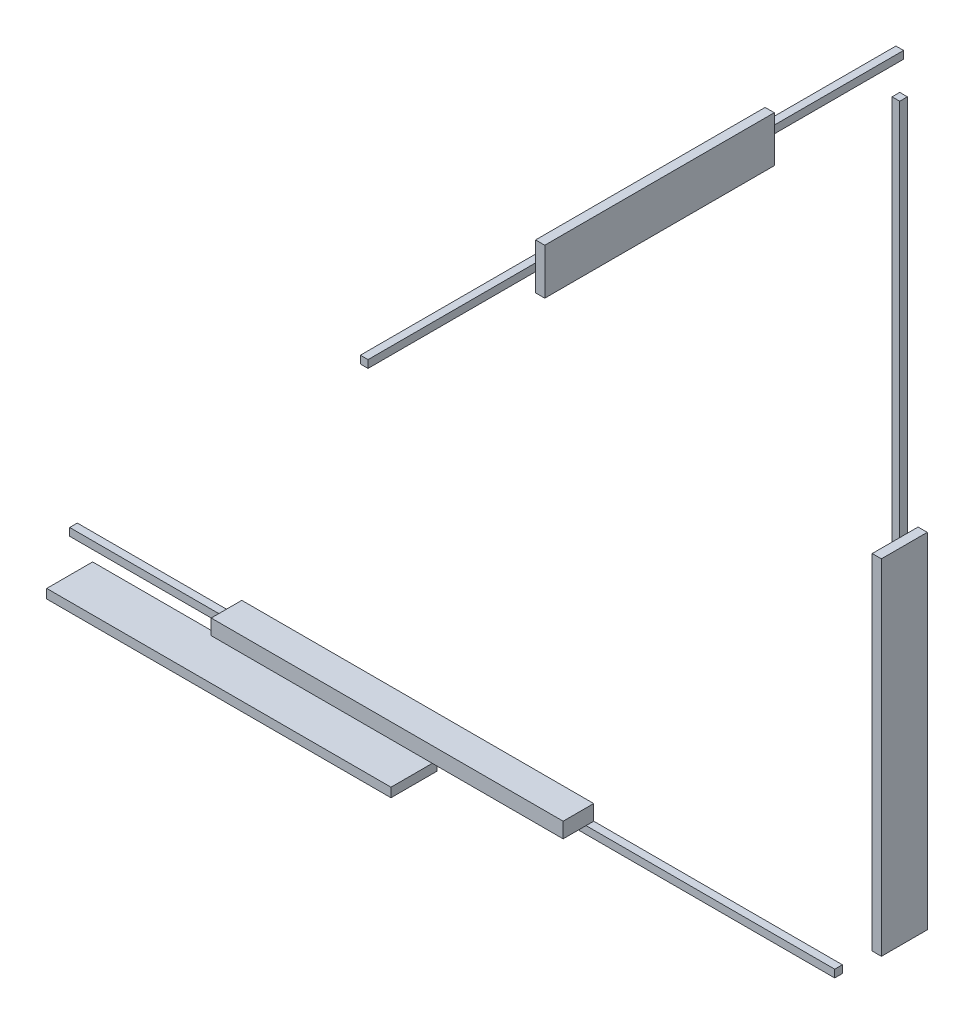
ISO-10303-21;
HEADER;
FILE_DESCRIPTION(('STEP AP214'),'2;1');
FILE_NAME('part.step','',(''),(''),'','','');
FILE_SCHEMA(('AUTOMOTIVE_DESIGN { 1 0 10303 214 1 1 1 1 }'));
ENDSEC;
DATA;
#1=APPLICATION_CONTEXT('core data for automotive mechanical design processes');
#2=APPLICATION_PROTOCOL_DEFINITION('international standard','automotive_design',2000,#1);
#3=PRODUCT_CONTEXT('',#1,'mechanical');
#4=PRODUCT('Part','Part','',(#3));
#5=PRODUCT_RELATED_PRODUCT_CATEGORY('part','',(#4));
#6=PRODUCT_DEFINITION_FORMATION('','',#4);
#7=PRODUCT_DEFINITION_CONTEXT('part definition',#1,'design');
#8=PRODUCT_DEFINITION('design','',#6,#7);
#9=PRODUCT_DEFINITION_SHAPE('','',#8);
#10=(LENGTH_UNIT() NAMED_UNIT(*) SI_UNIT(.MILLI.,.METRE.));
#11=(NAMED_UNIT(*) PLANE_ANGLE_UNIT() SI_UNIT($,.RADIAN.));
#12=(NAMED_UNIT(*) SI_UNIT($,.STERADIAN.) SOLID_ANGLE_UNIT());
#13=UNCERTAINTY_MEASURE_WITH_UNIT(LENGTH_MEASURE(1.E-05),#10,'distance_accuracy_value','');
#14=(GEOMETRIC_REPRESENTATION_CONTEXT(3) GLOBAL_UNCERTAINTY_ASSIGNED_CONTEXT((#13)) GLOBAL_UNIT_ASSIGNED_CONTEXT((#10,
#11,#12)) REPRESENTATION_CONTEXT('',''));
#15=CARTESIAN_POINT('',(0.,0.,0.));
#16=DIRECTION('',(0.,0.,1.));
#17=DIRECTION('',(1.,0.,0.));
#18=AXIS2_PLACEMENT_3D('',#15,#16,#17);
#19=CARTESIAN_POINT('',(61.6,49.,50.));
#20=DIRECTION('',(-1.,0.,0.));
#21=DIRECTION('',(0.,0.,1.));
#22=AXIS2_PLACEMENT_3D('',#19,#20,#21);
#23=PLANE('',#22);
#24=DIRECTION('',(0.,1.,0.));
#25=VECTOR('',#24,1.);
#26=CARTESIAN_POINT('',(61.6,49.,20.));
#27=LINE('',#26,#25);
#28=CARTESIAN_POINT('',(61.6,49.,20.));
#29=VERTEX_POINT('',#28);
#30=CARTESIAN_POINT('',(61.6,55.,20.));
#31=VERTEX_POINT('',#30);
#32=EDGE_CURVE('E109',#29,#31,#27,.T.);
#33=ORIENTED_EDGE('',*,*,#32,.T.);
#34=DIRECTION('',(0.,0.,-1.));
#35=VECTOR('',#34,1.);
#36=CARTESIAN_POINT('',(61.6,55.,50.));
#37=LINE('',#36,#35);
#38=CARTESIAN_POINT('',(61.6,55.,50.));
#39=VERTEX_POINT('',#38);
#40=EDGE_CURVE('E12',#39,#31,#37,.T.);
#41=ORIENTED_EDGE('',*,*,#40,.F.);
#42=DIRECTION('',(0.,1.,0.));
#43=VECTOR('',#42,1.);
#44=CARTESIAN_POINT('',(61.6,49.,50.));
#45=LINE('',#44,#43);
#46=CARTESIAN_POINT('',(61.6,49.,50.));
#47=VERTEX_POINT('',#46);
#48=EDGE_CURVE('E97',#47,#39,#45,.T.);
#49=ORIENTED_EDGE('',*,*,#48,.F.);
#50=DIRECTION('',(0.,0.,-1.));
#51=VECTOR('',#50,1.);
#52=CARTESIAN_POINT('',(61.6,49.,50.));
#53=LINE('',#52,#51);
#54=EDGE_CURVE('E105',#47,#29,#53,.T.);
#55=ORIENTED_EDGE('',*,*,#54,.T.);
#56=EDGE_LOOP('',(#33,#41,#49,#55));
#57=FACE_BOUND('',#56,.T.);
#58=ADVANCED_FACE('F46',(#57),#23,.F.);
#59=CARTESIAN_POINT('',(60.4,55.,50.));
#60=DIRECTION('',(0.,-1.,0.));
#61=DIRECTION('',(0.,0.,-1.));
#62=AXIS2_PLACEMENT_3D('',#59,#60,#61);
#63=PLANE('',#62);
#64=DIRECTION('',(-1.,0.,0.));
#65=VECTOR('',#64,1.);
#66=CARTESIAN_POINT('',(60.4,55.,20.));
#67=LINE('',#66,#65);
#68=CARTESIAN_POINT('',(60.4,55.,20.));
#69=VERTEX_POINT('',#68);
#70=EDGE_CURVE('E101',#31,#69,#67,.T.);
#71=ORIENTED_EDGE('',*,*,#70,.T.);
#72=DIRECTION('',(0.,0.,-1.));
#73=VECTOR('',#72,1.);
#74=CARTESIAN_POINT('',(60.4,55.,50.));
#75=LINE('',#74,#73);
#76=CARTESIAN_POINT('',(60.4,55.,50.));
#77=VERTEX_POINT('',#76);
#78=EDGE_CURVE('E54',#77,#69,#75,.T.);
#79=ORIENTED_EDGE('',*,*,#78,.F.);
#80=DIRECTION('',(-1.,0.,0.));
#81=VECTOR('',#80,1.);
#82=CARTESIAN_POINT('',(60.4,55.,50.));
#83=LINE('',#82,#81);
#84=EDGE_CURVE('E92',#39,#77,#83,.T.);
#85=ORIENTED_EDGE('',*,*,#84,.F.);
#86=ORIENTED_EDGE('',*,*,#40,.T.);
#87=EDGE_LOOP('',(#71,#79,#85,#86));
#88=FACE_BOUND('',#87,.T.);
#89=ADVANCED_FACE('F100',(#88),#63,.F.);
#90=CARTESIAN_POINT('',(60.4,49.,50.));
#91=DIRECTION('',(1.,0.,0.));
#92=DIRECTION('',(0.,0.,-1.));
#93=AXIS2_PLACEMENT_3D('',#90,#91,#92);
#94=PLANE('',#93);
#95=DIRECTION('',(0.,-1.,0.));
#96=VECTOR('',#95,1.);
#97=CARTESIAN_POINT('',(60.4,49.,20.));
#98=LINE('',#97,#96);
#99=CARTESIAN_POINT('',(60.4,49.,20.));
#100=VERTEX_POINT('',#99);
#101=EDGE_CURVE('E79',#69,#100,#98,.T.);
#102=ORIENTED_EDGE('',*,*,#101,.T.);
#103=DIRECTION('',(0.,0.,-1.));
#104=VECTOR('',#103,1.);
#105=CARTESIAN_POINT('',(60.4,49.,50.));
#106=LINE('',#105,#104);
#107=CARTESIAN_POINT('',(60.4,49.,50.));
#108=VERTEX_POINT('',#107);
#109=EDGE_CURVE('E102',#108,#100,#106,.T.);
#110=ORIENTED_EDGE('',*,*,#109,.F.);
#111=DIRECTION('',(0.,-1.,0.));
#112=VECTOR('',#111,1.);
#113=CARTESIAN_POINT('',(60.4,49.,50.));
#114=LINE('',#113,#112);
#115=EDGE_CURVE('E95',#77,#108,#114,.T.);
#116=ORIENTED_EDGE('',*,*,#115,.F.);
#117=ORIENTED_EDGE('',*,*,#78,.T.);
#118=EDGE_LOOP('',(#102,#110,#116,#117));
#119=FACE_BOUND('',#118,.T.);
#120=ADVANCED_FACE('F103',(#119),#94,.F.);
#121=CARTESIAN_POINT('',(60.4,49.,50.));
#122=DIRECTION('',(0.,1.,0.));
#123=DIRECTION('',(0.,0.,1.));
#124=AXIS2_PLACEMENT_3D('',#121,#122,#123);
#125=PLANE('',#124);
#126=DIRECTION('',(1.,0.,0.));
#127=VECTOR('',#126,1.);
#128=CARTESIAN_POINT('',(60.4,49.,20.));
#129=LINE('',#128,#127);
#130=EDGE_CURVE('E85',#100,#29,#129,.T.);
#131=ORIENTED_EDGE('',*,*,#130,.T.);
#132=ORIENTED_EDGE('',*,*,#54,.F.);
#133=DIRECTION('',(1.,0.,0.));
#134=VECTOR('',#133,1.);
#135=CARTESIAN_POINT('',(60.4,49.,50.));
#136=LINE('',#135,#134);
#137=EDGE_CURVE('E62',#108,#47,#136,.T.);
#138=ORIENTED_EDGE('',*,*,#137,.F.);
#139=ORIENTED_EDGE('',*,*,#109,.T.);
#140=EDGE_LOOP('',(#131,#132,#138,#139));
#141=FACE_BOUND('',#140,.T.);
#142=ADVANCED_FACE('F116',(#141),#125,.F.);
#143=CARTESIAN_POINT('',(0.,0.,50.));
#144=DIRECTION('',(0.,0.,-1.));
#145=DIRECTION('',(-1.,0.,0.));
#146=AXIS2_PLACEMENT_3D('',#143,#144,#145);
#147=PLANE('',#146);
#148=ORIENTED_EDGE('',*,*,#48,.T.);
#149=ORIENTED_EDGE('',*,*,#84,.T.);
#150=ORIENTED_EDGE('',*,*,#115,.T.);
#151=ORIENTED_EDGE('',*,*,#137,.T.);
#152=EDGE_LOOP('',(#148,#149,#150,#151));
#153=FACE_BOUND('',#152,.T.);
#154=ADVANCED_FACE('F93',(#153),#147,.F.);
#155=CARTESIAN_POINT('',(0.,0.,20.));
#156=DIRECTION('',(0.,0.,-1.));
#157=DIRECTION('',(-1.,0.,0.));
#158=AXIS2_PLACEMENT_3D('',#155,#156,#157);
#159=PLANE('',#158);
#160=ORIENTED_EDGE('',*,*,#32,.F.);
#161=ORIENTED_EDGE('',*,*,#130,.F.);
#162=ORIENTED_EDGE('',*,*,#101,.F.);
#163=ORIENTED_EDGE('',*,*,#70,.F.);
#164=EDGE_LOOP('',(#160,#161,#162,#163));
#165=FACE_BOUND('',#164,.T.);
#166=ADVANCED_FACE('F119',(#165),#159,.T.);
#167=CLOSED_SHELL('',(#58,#89,#120,#142,#154,#166));
#168=MANIFOLD_SOLID_BREP('B2',#167);
#169=CARTESIAN_POINT('',(61.6,-47.5,6.));
#170=DIRECTION('',(-1.,0.,0.));
#171=DIRECTION('',(0.,0.,1.));
#172=AXIS2_PLACEMENT_3D('',#169,#170,#171);
#173=PLANE('',#172);
#174=DIRECTION('',(0.,1.,0.));
#175=VECTOR('',#174,1.);
#176=CARTESIAN_POINT('',(61.6,-47.5,0.));
#177=LINE('',#176,#175);
#178=CARTESIAN_POINT('',(61.6,-47.5,0.));
#179=VERTEX_POINT('',#178);
#180=CARTESIAN_POINT('',(61.6,-2.5,0.));
#181=VERTEX_POINT('',#180);
#182=EDGE_CURVE('E243',#179,#181,#177,.T.);
#183=ORIENTED_EDGE('',*,*,#182,.T.);
#184=DIRECTION('',(0.,0.,-1.));
#185=VECTOR('',#184,1.);
#186=CARTESIAN_POINT('',(61.6,-2.5,6.));
#187=LINE('',#186,#185);
#188=CARTESIAN_POINT('',(61.6,-2.5,6.));
#189=VERTEX_POINT('',#188);
#190=EDGE_CURVE('E44',#189,#181,#187,.T.);
#191=ORIENTED_EDGE('',*,*,#190,.F.);
#192=DIRECTION('',(0.,1.,0.));
#193=VECTOR('',#192,1.);
#194=CARTESIAN_POINT('',(61.6,-47.5,6.));
#195=LINE('',#194,#193);
#196=CARTESIAN_POINT('',(61.6,-47.5,6.));
#197=VERTEX_POINT('',#196);
#198=EDGE_CURVE('E231',#197,#189,#195,.T.);
#199=ORIENTED_EDGE('',*,*,#198,.F.);
#200=DIRECTION('',(0.,0.,-1.));
#201=VECTOR('',#200,1.);
#202=CARTESIAN_POINT('',(61.6,-47.5,6.));
#203=LINE('',#202,#201);
#204=EDGE_CURVE('E239',#197,#179,#203,.T.);
#205=ORIENTED_EDGE('',*,*,#204,.T.);
#206=EDGE_LOOP('',(#183,#191,#199,#205));
#207=FACE_BOUND('',#206,.T.);
#208=ADVANCED_FACE('F180',(#207),#173,.F.);
#209=CARTESIAN_POINT('',(60.4,-2.5,6.));
#210=DIRECTION('',(0.,-1.,0.));
#211=DIRECTION('',(0.,0.,-1.));
#212=AXIS2_PLACEMENT_3D('',#209,#210,#211);
#213=PLANE('',#212);
#214=DIRECTION('',(-1.,0.,0.));
#215=VECTOR('',#214,1.);
#216=CARTESIAN_POINT('',(60.4,-2.5,0.));
#217=LINE('',#216,#215);
#218=CARTESIAN_POINT('',(60.4,-2.5,0.));
#219=VERTEX_POINT('',#218);
#220=EDGE_CURVE('E235',#181,#219,#217,.T.);
#221=ORIENTED_EDGE('',*,*,#220,.T.);
#222=DIRECTION('',(0.,0.,-1.));
#223=VECTOR('',#222,1.);
#224=CARTESIAN_POINT('',(60.4,-2.5,6.));
#225=LINE('',#224,#223);
#226=CARTESIAN_POINT('',(60.4,-2.5,6.));
#227=VERTEX_POINT('',#226);
#228=EDGE_CURVE('E188',#227,#219,#225,.T.);
#229=ORIENTED_EDGE('',*,*,#228,.F.);
#230=DIRECTION('',(-1.,0.,0.));
#231=VECTOR('',#230,1.);
#232=CARTESIAN_POINT('',(60.4,-2.5,6.));
#233=LINE('',#232,#231);
#234=EDGE_CURVE('E226',#189,#227,#233,.T.);
#235=ORIENTED_EDGE('',*,*,#234,.F.);
#236=ORIENTED_EDGE('',*,*,#190,.T.);
#237=EDGE_LOOP('',(#221,#229,#235,#236));
#238=FACE_BOUND('',#237,.T.);
#239=ADVANCED_FACE('F234',(#238),#213,.F.);
#240=CARTESIAN_POINT('',(60.4,-47.5,6.));
#241=DIRECTION('',(1.,0.,0.));
#242=DIRECTION('',(0.,0.,-1.));
#243=AXIS2_PLACEMENT_3D('',#240,#241,#242);
#244=PLANE('',#243);
#245=DIRECTION('',(0.,-1.,0.));
#246=VECTOR('',#245,1.);
#247=CARTESIAN_POINT('',(60.4,-47.5,0.));
#248=LINE('',#247,#246);
#249=CARTESIAN_POINT('',(60.4,-47.5,0.));
#250=VERTEX_POINT('',#249);
#251=EDGE_CURVE('E213',#219,#250,#248,.T.);
#252=ORIENTED_EDGE('',*,*,#251,.T.);
#253=DIRECTION('',(0.,0.,-1.));
#254=VECTOR('',#253,1.);
#255=CARTESIAN_POINT('',(60.4,-47.5,6.));
#256=LINE('',#255,#254);
#257=CARTESIAN_POINT('',(60.4,-47.5,6.));
#258=VERTEX_POINT('',#257);
#259=EDGE_CURVE('E236',#258,#250,#256,.T.);
#260=ORIENTED_EDGE('',*,*,#259,.F.);
#261=DIRECTION('',(0.,-1.,0.));
#262=VECTOR('',#261,1.);
#263=CARTESIAN_POINT('',(60.4,-47.5,6.));
#264=LINE('',#263,#262);
#265=EDGE_CURVE('E229',#227,#258,#264,.T.);
#266=ORIENTED_EDGE('',*,*,#265,.F.);
#267=ORIENTED_EDGE('',*,*,#228,.T.);
#268=EDGE_LOOP('',(#252,#260,#266,#267));
#269=FACE_BOUND('',#268,.T.);
#270=ADVANCED_FACE('F237',(#269),#244,.F.);
#271=CARTESIAN_POINT('',(60.4,-47.5,6.));
#272=DIRECTION('',(0.,1.,0.));
#273=DIRECTION('',(0.,0.,1.));
#274=AXIS2_PLACEMENT_3D('',#271,#272,#273);
#275=PLANE('',#274);
#276=DIRECTION('',(1.,0.,0.));
#277=VECTOR('',#276,1.);
#278=CARTESIAN_POINT('',(60.4,-47.5,0.));
#279=LINE('',#278,#277);
#280=EDGE_CURVE('E219',#250,#179,#279,.T.);
#281=ORIENTED_EDGE('',*,*,#280,.T.);
#282=ORIENTED_EDGE('',*,*,#204,.F.);
#283=DIRECTION('',(1.,0.,0.));
#284=VECTOR('',#283,1.);
#285=CARTESIAN_POINT('',(60.4,-47.5,6.));
#286=LINE('',#285,#284);
#287=EDGE_CURVE('E196',#258,#197,#286,.T.);
#288=ORIENTED_EDGE('',*,*,#287,.F.);
#289=ORIENTED_EDGE('',*,*,#259,.T.);
#290=EDGE_LOOP('',(#281,#282,#288,#289));
#291=FACE_BOUND('',#290,.T.);
#292=ADVANCED_FACE('F250',(#291),#275,.F.);
#293=CARTESIAN_POINT('',(0.,0.,6.));
#294=DIRECTION('',(0.,0.,-1.));
#295=DIRECTION('',(-1.,0.,0.));
#296=AXIS2_PLACEMENT_3D('',#293,#294,#295);
#297=PLANE('',#296);
#298=ORIENTED_EDGE('',*,*,#198,.T.);
#299=ORIENTED_EDGE('',*,*,#234,.T.);
#300=ORIENTED_EDGE('',*,*,#265,.T.);
#301=ORIENTED_EDGE('',*,*,#287,.T.);
#302=EDGE_LOOP('',(#298,#299,#300,#301));
#303=FACE_BOUND('',#302,.T.);
#304=ADVANCED_FACE('F227',(#303),#297,.F.);
#305=CARTESIAN_POINT('',(0.,0.,0.));
#306=DIRECTION('',(0.,0.,-1.));
#307=DIRECTION('',(-1.,0.,0.));
#308=AXIS2_PLACEMENT_3D('',#305,#306,#307);
#309=PLANE('',#308);
#310=ORIENTED_EDGE('',*,*,#182,.F.);
#311=ORIENTED_EDGE('',*,*,#280,.F.);
#312=ORIENTED_EDGE('',*,*,#251,.F.);
#313=ORIENTED_EDGE('',*,*,#220,.F.);
#314=EDGE_LOOP('',(#310,#311,#312,#313));
#315=FACE_BOUND('',#314,.T.);
#316=ADVANCED_FACE('F253',(#315),#309,.T.);
#317=CLOSED_SHELL('',(#208,#239,#270,#292,#304,#316));
#318=MANIFOLD_SOLID_BREP('B6',#317);
#319=CARTESIAN_POINT('',(-2.5,-61.6,6.));
#320=DIRECTION('',(-1.,0.,0.));
#321=DIRECTION('',(0.,0.,1.));
#322=AXIS2_PLACEMENT_3D('',#319,#320,#321);
#323=PLANE('',#322);
#324=DIRECTION('',(0.,1.,0.));
#325=VECTOR('',#324,1.);
#326=CARTESIAN_POINT('',(-2.5,-61.6,0.));
#327=LINE('',#326,#325);
#328=CARTESIAN_POINT('',(-2.5,-61.6,0.));
#329=VERTEX_POINT('',#328);
#330=CARTESIAN_POINT('',(-2.5,-60.4,0.));
#331=VERTEX_POINT('',#330);
#332=EDGE_CURVE('E377',#329,#331,#327,.T.);
#333=ORIENTED_EDGE('',*,*,#332,.T.);
#334=DIRECTION('',(0.,0.,-1.));
#335=VECTOR('',#334,1.);
#336=CARTESIAN_POINT('',(-2.5,-60.4,6.));
#337=LINE('',#336,#335);
#338=CARTESIAN_POINT('',(-2.5,-60.4,6.));
#339=VERTEX_POINT('',#338);
#340=EDGE_CURVE('E178',#339,#331,#337,.T.);
#341=ORIENTED_EDGE('',*,*,#340,.F.);
#342=DIRECTION('',(0.,1.,0.));
#343=VECTOR('',#342,1.);
#344=CARTESIAN_POINT('',(-2.5,-61.6,6.));
#345=LINE('',#344,#343);
#346=CARTESIAN_POINT('',(-2.5,-61.6,6.));
#347=VERTEX_POINT('',#346);
#348=EDGE_CURVE('E365',#347,#339,#345,.T.);
#349=ORIENTED_EDGE('',*,*,#348,.F.);
#350=DIRECTION('',(0.,0.,-1.));
#351=VECTOR('',#350,1.);
#352=CARTESIAN_POINT('',(-2.5,-61.6,6.));
#353=LINE('',#352,#351);
#354=EDGE_CURVE('E373',#347,#329,#353,.T.);
#355=ORIENTED_EDGE('',*,*,#354,.T.);
#356=EDGE_LOOP('',(#333,#341,#349,#355));
#357=FACE_BOUND('',#356,.T.);
#358=ADVANCED_FACE('F314',(#357),#323,.F.);
#359=CARTESIAN_POINT('',(-47.5,-60.4,6.));
#360=DIRECTION('',(0.,-1.,0.));
#361=DIRECTION('',(0.,0.,-1.));
#362=AXIS2_PLACEMENT_3D('',#359,#360,#361);
#363=PLANE('',#362);
#364=DIRECTION('',(-1.,0.,0.));
#365=VECTOR('',#364,1.);
#366=CARTESIAN_POINT('',(-47.5,-60.4,0.));
#367=LINE('',#366,#365);
#368=CARTESIAN_POINT('',(-47.5,-60.4,0.));
#369=VERTEX_POINT('',#368);
#370=EDGE_CURVE('E369',#331,#369,#367,.T.);
#371=ORIENTED_EDGE('',*,*,#370,.T.);
#372=DIRECTION('',(0.,0.,-1.));
#373=VECTOR('',#372,1.);
#374=CARTESIAN_POINT('',(-47.5,-60.4,6.));
#375=LINE('',#374,#373);
#376=CARTESIAN_POINT('',(-47.5,-60.4,6.));
#377=VERTEX_POINT('',#376);
#378=EDGE_CURVE('E322',#377,#369,#375,.T.);
#379=ORIENTED_EDGE('',*,*,#378,.F.);
#380=DIRECTION('',(-1.,0.,0.));
#381=VECTOR('',#380,1.);
#382=CARTESIAN_POINT('',(-47.5,-60.4,6.));
#383=LINE('',#382,#381);
#384=EDGE_CURVE('E360',#339,#377,#383,.T.);
#385=ORIENTED_EDGE('',*,*,#384,.F.);
#386=ORIENTED_EDGE('',*,*,#340,.T.);
#387=EDGE_LOOP('',(#371,#379,#385,#386));
#388=FACE_BOUND('',#387,.T.);
#389=ADVANCED_FACE('F368',(#388),#363,.F.);
#390=CARTESIAN_POINT('',(-47.5,-61.6,6.));
#391=DIRECTION('',(1.,0.,0.));
#392=DIRECTION('',(0.,0.,-1.));
#393=AXIS2_PLACEMENT_3D('',#390,#391,#392);
#394=PLANE('',#393);
#395=DIRECTION('',(0.,-1.,0.));
#396=VECTOR('',#395,1.);
#397=CARTESIAN_POINT('',(-47.5,-61.6,0.));
#398=LINE('',#397,#396);
#399=CARTESIAN_POINT('',(-47.5,-61.6,0.));
#400=VERTEX_POINT('',#399);
#401=EDGE_CURVE('E347',#369,#400,#398,.T.);
#402=ORIENTED_EDGE('',*,*,#401,.T.);
#403=DIRECTION('',(0.,0.,-1.));
#404=VECTOR('',#403,1.);
#405=CARTESIAN_POINT('',(-47.5,-61.6,6.));
#406=LINE('',#405,#404);
#407=CARTESIAN_POINT('',(-47.5,-61.6,6.));
#408=VERTEX_POINT('',#407);
#409=EDGE_CURVE('E370',#408,#400,#406,.T.);
#410=ORIENTED_EDGE('',*,*,#409,.F.);
#411=DIRECTION('',(0.,-1.,0.));
#412=VECTOR('',#411,1.);
#413=CARTESIAN_POINT('',(-47.5,-61.6,6.));
#414=LINE('',#413,#412);
#415=EDGE_CURVE('E363',#377,#408,#414,.T.);
#416=ORIENTED_EDGE('',*,*,#415,.F.);
#417=ORIENTED_EDGE('',*,*,#378,.T.);
#418=EDGE_LOOP('',(#402,#410,#416,#417));
#419=FACE_BOUND('',#418,.T.);
#420=ADVANCED_FACE('F371',(#419),#394,.F.);
#421=CARTESIAN_POINT('',(-47.5,-61.6,6.));
#422=DIRECTION('',(0.,1.,0.));
#423=DIRECTION('',(0.,0.,1.));
#424=AXIS2_PLACEMENT_3D('',#421,#422,#423);
#425=PLANE('',#424);
#426=DIRECTION('',(1.,0.,0.));
#427=VECTOR('',#426,1.);
#428=CARTESIAN_POINT('',(-47.5,-61.6,0.));
#429=LINE('',#428,#427);
#430=EDGE_CURVE('E353',#400,#329,#429,.T.);
#431=ORIENTED_EDGE('',*,*,#430,.T.);
#432=ORIENTED_EDGE('',*,*,#354,.F.);
#433=DIRECTION('',(1.,0.,0.));
#434=VECTOR('',#433,1.);
#435=CARTESIAN_POINT('',(-47.5,-61.6,6.));
#436=LINE('',#435,#434);
#437=EDGE_CURVE('E330',#408,#347,#436,.T.);
#438=ORIENTED_EDGE('',*,*,#437,.F.);
#439=ORIENTED_EDGE('',*,*,#409,.T.);
#440=EDGE_LOOP('',(#431,#432,#438,#439));
#441=FACE_BOUND('',#440,.T.);
#442=ADVANCED_FACE('F384',(#441),#425,.F.);
#443=CARTESIAN_POINT('',(0.,0.,6.));
#444=DIRECTION('',(0.,0.,-1.));
#445=DIRECTION('',(-1.,0.,0.));
#446=AXIS2_PLACEMENT_3D('',#443,#444,#445);
#447=PLANE('',#446);
#448=ORIENTED_EDGE('',*,*,#348,.T.);
#449=ORIENTED_EDGE('',*,*,#384,.T.);
#450=ORIENTED_EDGE('',*,*,#415,.T.);
#451=ORIENTED_EDGE('',*,*,#437,.T.);
#452=EDGE_LOOP('',(#448,#449,#450,#451));
#453=FACE_BOUND('',#452,.T.);
#454=ADVANCED_FACE('F361',(#453),#447,.F.);
#455=CARTESIAN_POINT('',(0.,0.,0.));
#456=DIRECTION('',(0.,0.,-1.));
#457=DIRECTION('',(-1.,0.,0.));
#458=AXIS2_PLACEMENT_3D('',#455,#456,#457);
#459=PLANE('',#458);
#460=ORIENTED_EDGE('',*,*,#332,.F.);
#461=ORIENTED_EDGE('',*,*,#430,.F.);
#462=ORIENTED_EDGE('',*,*,#401,.F.);
#463=ORIENTED_EDGE('',*,*,#370,.F.);
#464=EDGE_LOOP('',(#460,#461,#462,#463));
#465=FACE_BOUND('',#464,.T.);
#466=ADVANCED_FACE('F387',(#465),#459,.T.);
#467=CLOSED_SHELL('',(#358,#389,#420,#442,#454,#466));
#468=MANIFOLD_SOLID_BREP('B38',#467);
#469=CARTESIAN_POINT('',(23.,-52.,9.));
#470=DIRECTION('',(-1.,0.,0.));
#471=DIRECTION('',(0.,0.,1.));
#472=AXIS2_PLACEMENT_3D('',#469,#470,#471);
#473=PLANE('',#472);
#474=DIRECTION('',(0.,1.,0.));
#475=VECTOR('',#474,1.);
#476=CARTESIAN_POINT('',(23.,-52.,5.));
#477=LINE('',#476,#475);
#478=CARTESIAN_POINT('',(23.,-52.,5.));
#479=VERTEX_POINT('',#478);
#480=CARTESIAN_POINT('',(23.,-50.,5.));
#481=VERTEX_POINT('',#480);
#482=EDGE_CURVE('E511',#479,#481,#477,.T.);
#483=ORIENTED_EDGE('',*,*,#482,.T.);
#484=DIRECTION('',(0.,0.,-1.));
#485=VECTOR('',#484,1.);
#486=CARTESIAN_POINT('',(23.,-50.,9.));
#487=LINE('',#486,#485);
#488=CARTESIAN_POINT('',(23.,-50.,9.));
#489=VERTEX_POINT('',#488);
#490=EDGE_CURVE('E312',#489,#481,#487,.T.);
#491=ORIENTED_EDGE('',*,*,#490,.F.);
#492=DIRECTION('',(0.,1.,0.));
#493=VECTOR('',#492,1.);
#494=CARTESIAN_POINT('',(23.,-52.,9.));
#495=LINE('',#494,#493);
#496=CARTESIAN_POINT('',(23.,-52.,9.));
#497=VERTEX_POINT('',#496);
#498=EDGE_CURVE('E499',#497,#489,#495,.T.);
#499=ORIENTED_EDGE('',*,*,#498,.F.);
#500=DIRECTION('',(0.,0.,-1.));
#501=VECTOR('',#500,1.);
#502=CARTESIAN_POINT('',(23.,-52.,9.));
#503=LINE('',#502,#501);
#504=EDGE_CURVE('E507',#497,#479,#503,.T.);
#505=ORIENTED_EDGE('',*,*,#504,.T.);
#506=EDGE_LOOP('',(#483,#491,#499,#505));
#507=FACE_BOUND('',#506,.T.);
#508=ADVANCED_FACE('F448',(#507),#473,.F.);
#509=CARTESIAN_POINT('',(-23.,-50.,9.));
#510=DIRECTION('',(0.,-1.,0.));
#511=DIRECTION('',(0.,0.,-1.));
#512=AXIS2_PLACEMENT_3D('',#509,#510,#511);
#513=PLANE('',#512);
#514=DIRECTION('',(-1.,0.,0.));
#515=VECTOR('',#514,1.);
#516=CARTESIAN_POINT('',(-23.,-50.,5.));
#517=LINE('',#516,#515);
#518=CARTESIAN_POINT('',(-23.,-50.,5.));
#519=VERTEX_POINT('',#518);
#520=EDGE_CURVE('E503',#481,#519,#517,.T.);
#521=ORIENTED_EDGE('',*,*,#520,.T.);
#522=DIRECTION('',(0.,0.,-1.));
#523=VECTOR('',#522,1.);
#524=CARTESIAN_POINT('',(-23.,-50.,9.));
#525=LINE('',#524,#523);
#526=CARTESIAN_POINT('',(-23.,-50.,9.));
#527=VERTEX_POINT('',#526);
#528=EDGE_CURVE('E456',#527,#519,#525,.T.);
#529=ORIENTED_EDGE('',*,*,#528,.F.);
#530=DIRECTION('',(-1.,0.,0.));
#531=VECTOR('',#530,1.);
#532=CARTESIAN_POINT('',(-23.,-50.,9.));
#533=LINE('',#532,#531);
#534=EDGE_CURVE('E494',#489,#527,#533,.T.);
#535=ORIENTED_EDGE('',*,*,#534,.F.);
#536=ORIENTED_EDGE('',*,*,#490,.T.);
#537=EDGE_LOOP('',(#521,#529,#535,#536));
#538=FACE_BOUND('',#537,.T.);
#539=ADVANCED_FACE('F502',(#538),#513,.F.);
#540=CARTESIAN_POINT('',(-23.,-52.,9.));
#541=DIRECTION('',(1.,0.,0.));
#542=DIRECTION('',(0.,0.,-1.));
#543=AXIS2_PLACEMENT_3D('',#540,#541,#542);
#544=PLANE('',#543);
#545=DIRECTION('',(0.,-1.,0.));
#546=VECTOR('',#545,1.);
#547=CARTESIAN_POINT('',(-23.,-52.,5.));
#548=LINE('',#547,#546);
#549=CARTESIAN_POINT('',(-23.,-52.,5.));
#550=VERTEX_POINT('',#549);
#551=EDGE_CURVE('E481',#519,#550,#548,.T.);
#552=ORIENTED_EDGE('',*,*,#551,.T.);
#553=DIRECTION('',(0.,0.,-1.));
#554=VECTOR('',#553,1.);
#555=CARTESIAN_POINT('',(-23.,-52.,9.));
#556=LINE('',#555,#554);
#557=CARTESIAN_POINT('',(-23.,-52.,9.));
#558=VERTEX_POINT('',#557);
#559=EDGE_CURVE('E504',#558,#550,#556,.T.);
#560=ORIENTED_EDGE('',*,*,#559,.F.);
#561=DIRECTION('',(0.,-1.,0.));
#562=VECTOR('',#561,1.);
#563=CARTESIAN_POINT('',(-23.,-52.,9.));
#564=LINE('',#563,#562);
#565=EDGE_CURVE('E497',#527,#558,#564,.T.);
#566=ORIENTED_EDGE('',*,*,#565,.F.);
#567=ORIENTED_EDGE('',*,*,#528,.T.);
#568=EDGE_LOOP('',(#552,#560,#566,#567));
#569=FACE_BOUND('',#568,.T.);
#570=ADVANCED_FACE('F505',(#569),#544,.F.);
#571=CARTESIAN_POINT('',(-23.,-52.,9.));
#572=DIRECTION('',(0.,1.,0.));
#573=DIRECTION('',(0.,0.,1.));
#574=AXIS2_PLACEMENT_3D('',#571,#572,#573);
#575=PLANE('',#574);
#576=DIRECTION('',(1.,0.,0.));
#577=VECTOR('',#576,1.);
#578=CARTESIAN_POINT('',(-23.,-52.,5.));
#579=LINE('',#578,#577);
#580=EDGE_CURVE('E487',#550,#479,#579,.T.);
#581=ORIENTED_EDGE('',*,*,#580,.T.);
#582=ORIENTED_EDGE('',*,*,#504,.F.);
#583=DIRECTION('',(1.,0.,0.));
#584=VECTOR('',#583,1.);
#585=CARTESIAN_POINT('',(-23.,-52.,9.));
#586=LINE('',#585,#584);
#587=EDGE_CURVE('E464',#558,#497,#586,.T.);
#588=ORIENTED_EDGE('',*,*,#587,.F.);
#589=ORIENTED_EDGE('',*,*,#559,.T.);
#590=EDGE_LOOP('',(#581,#582,#588,#589));
#591=FACE_BOUND('',#590,.T.);
#592=ADVANCED_FACE('F518',(#591),#575,.F.);
#593=CARTESIAN_POINT('',(0.,0.,9.));
#594=DIRECTION('',(0.,0.,-1.));
#595=DIRECTION('',(-1.,0.,0.));
#596=AXIS2_PLACEMENT_3D('',#593,#594,#595);
#597=PLANE('',#596);
#598=ORIENTED_EDGE('',*,*,#498,.T.);
#599=ORIENTED_EDGE('',*,*,#534,.T.);
#600=ORIENTED_EDGE('',*,*,#565,.T.);
#601=ORIENTED_EDGE('',*,*,#587,.T.);
#602=EDGE_LOOP('',(#598,#599,#600,#601));
#603=FACE_BOUND('',#602,.T.);
#604=ADVANCED_FACE('F495',(#603),#597,.F.);
#605=CARTESIAN_POINT('',(0.,0.,5.));
#606=DIRECTION('',(0.,0.,-1.));
#607=DIRECTION('',(-1.,0.,0.));
#608=AXIS2_PLACEMENT_3D('',#605,#606,#607);
#609=PLANE('',#608);
#610=ORIENTED_EDGE('',*,*,#482,.F.);
#611=ORIENTED_EDGE('',*,*,#580,.F.);
#612=ORIENTED_EDGE('',*,*,#551,.F.);
#613=ORIENTED_EDGE('',*,*,#520,.F.);
#614=EDGE_LOOP('',(#610,#611,#612,#613));
#615=FACE_BOUND('',#614,.T.);
#616=ADVANCED_FACE('F521',(#615),#609,.T.);
#617=CLOSED_SHELL('',(#508,#539,#570,#592,#604,#616));
#618=MANIFOLD_SOLID_BREP('B172',#617);
#619=CARTESIAN_POINT('',(58.5,49.5,70.));
#620=DIRECTION('',(-1.,0.,0.));
#621=DIRECTION('',(0.,0.,1.));
#622=AXIS2_PLACEMENT_3D('',#619,#620,#621);
#623=PLANE('',#622);
#624=DIRECTION('',(0.,1.,0.));
#625=VECTOR('',#624,1.);
#626=CARTESIAN_POINT('',(58.5,49.5,0.));
#627=LINE('',#626,#625);
#628=CARTESIAN_POINT('',(58.5,49.5,0.));
#629=VERTEX_POINT('',#628);
#630=CARTESIAN_POINT('',(58.5,50.5,0.));
#631=VERTEX_POINT('',#630);
#632=EDGE_CURVE('E645',#629,#631,#627,.T.);
#633=ORIENTED_EDGE('',*,*,#632,.T.);
#634=DIRECTION('',(0.,0.,-1.));
#635=VECTOR('',#634,1.);
#636=CARTESIAN_POINT('',(58.5,50.5,70.));
#637=LINE('',#636,#635);
#638=CARTESIAN_POINT('',(58.5,50.5,70.));
#639=VERTEX_POINT('',#638);
#640=EDGE_CURVE('E446',#639,#631,#637,.T.);
#641=ORIENTED_EDGE('',*,*,#640,.F.);
#642=DIRECTION('',(0.,1.,0.));
#643=VECTOR('',#642,1.);
#644=CARTESIAN_POINT('',(58.5,49.5,70.));
#645=LINE('',#644,#643);
#646=CARTESIAN_POINT('',(58.5,49.5,70.));
#647=VERTEX_POINT('',#646);
#648=EDGE_CURVE('E633',#647,#639,#645,.T.);
#649=ORIENTED_EDGE('',*,*,#648,.F.);
#650=DIRECTION('',(0.,0.,-1.));
#651=VECTOR('',#650,1.);
#652=CARTESIAN_POINT('',(58.5,49.5,70.));
#653=LINE('',#652,#651);
#654=EDGE_CURVE('E641',#647,#629,#653,.T.);
#655=ORIENTED_EDGE('',*,*,#654,.T.);
#656=EDGE_LOOP('',(#633,#641,#649,#655));
#657=FACE_BOUND('',#656,.T.);
#658=ADVANCED_FACE('F582',(#657),#623,.F.);
#659=CARTESIAN_POINT('',(57.5,50.5,70.));
#660=DIRECTION('',(0.,-1.,0.));
#661=DIRECTION('',(0.,0.,-1.));
#662=AXIS2_PLACEMENT_3D('',#659,#660,#661);
#663=PLANE('',#662);
#664=DIRECTION('',(-1.,0.,0.));
#665=VECTOR('',#664,1.);
#666=CARTESIAN_POINT('',(57.5,50.5,0.));
#667=LINE('',#666,#665);
#668=CARTESIAN_POINT('',(57.5,50.5,0.));
#669=VERTEX_POINT('',#668);
#670=EDGE_CURVE('E637',#631,#669,#667,.T.);
#671=ORIENTED_EDGE('',*,*,#670,.T.);
#672=DIRECTION('',(0.,0.,-1.));
#673=VECTOR('',#672,1.);
#674=CARTESIAN_POINT('',(57.5,50.5,70.));
#675=LINE('',#674,#673);
#676=CARTESIAN_POINT('',(57.5,50.5,70.));
#677=VERTEX_POINT('',#676);
#678=EDGE_CURVE('E590',#677,#669,#675,.T.);
#679=ORIENTED_EDGE('',*,*,#678,.F.);
#680=DIRECTION('',(-1.,0.,0.));
#681=VECTOR('',#680,1.);
#682=CARTESIAN_POINT('',(57.5,50.5,70.));
#683=LINE('',#682,#681);
#684=EDGE_CURVE('E628',#639,#677,#683,.T.);
#685=ORIENTED_EDGE('',*,*,#684,.F.);
#686=ORIENTED_EDGE('',*,*,#640,.T.);
#687=EDGE_LOOP('',(#671,#679,#685,#686));
#688=FACE_BOUND('',#687,.T.);
#689=ADVANCED_FACE('F636',(#688),#663,.F.);
#690=CARTESIAN_POINT('',(57.5,49.5,70.));
#691=DIRECTION('',(1.,0.,0.));
#692=DIRECTION('',(0.,0.,-1.));
#693=AXIS2_PLACEMENT_3D('',#690,#691,#692);
#694=PLANE('',#693);
#695=DIRECTION('',(0.,-1.,0.));
#696=VECTOR('',#695,1.);
#697=CARTESIAN_POINT('',(57.5,49.5,0.));
#698=LINE('',#697,#696);
#699=CARTESIAN_POINT('',(57.5,49.5,0.));
#700=VERTEX_POINT('',#699);
#701=EDGE_CURVE('E615',#669,#700,#698,.T.);
#702=ORIENTED_EDGE('',*,*,#701,.T.);
#703=DIRECTION('',(0.,0.,-1.));
#704=VECTOR('',#703,1.);
#705=CARTESIAN_POINT('',(57.5,49.5,70.));
#706=LINE('',#705,#704);
#707=CARTESIAN_POINT('',(57.5,49.5,70.));
#708=VERTEX_POINT('',#707);
#709=EDGE_CURVE('E638',#708,#700,#706,.T.);
#710=ORIENTED_EDGE('',*,*,#709,.F.);
#711=DIRECTION('',(0.,-1.,0.));
#712=VECTOR('',#711,1.);
#713=CARTESIAN_POINT('',(57.5,49.5,70.));
#714=LINE('',#713,#712);
#715=EDGE_CURVE('E631',#677,#708,#714,.T.);
#716=ORIENTED_EDGE('',*,*,#715,.F.);
#717=ORIENTED_EDGE('',*,*,#678,.T.);
#718=EDGE_LOOP('',(#702,#710,#716,#717));
#719=FACE_BOUND('',#718,.T.);
#720=ADVANCED_FACE('F639',(#719),#694,.F.);
#721=CARTESIAN_POINT('',(57.5,49.5,70.));
#722=DIRECTION('',(0.,1.,0.));
#723=DIRECTION('',(0.,0.,1.));
#724=AXIS2_PLACEMENT_3D('',#721,#722,#723);
#725=PLANE('',#724);
#726=DIRECTION('',(1.,0.,0.));
#727=VECTOR('',#726,1.);
#728=CARTESIAN_POINT('',(57.5,49.5,0.));
#729=LINE('',#728,#727);
#730=EDGE_CURVE('E621',#700,#629,#729,.T.);
#731=ORIENTED_EDGE('',*,*,#730,.T.);
#732=ORIENTED_EDGE('',*,*,#654,.F.);
#733=DIRECTION('',(1.,0.,0.));
#734=VECTOR('',#733,1.);
#735=CARTESIAN_POINT('',(57.5,49.5,70.));
#736=LINE('',#735,#734);
#737=EDGE_CURVE('E598',#708,#647,#736,.T.);
#738=ORIENTED_EDGE('',*,*,#737,.F.);
#739=ORIENTED_EDGE('',*,*,#709,.T.);
#740=EDGE_LOOP('',(#731,#732,#738,#739));
#741=FACE_BOUND('',#740,.T.);
#742=ADVANCED_FACE('F652',(#741),#725,.F.);
#743=CARTESIAN_POINT('',(0.,0.,70.));
#744=DIRECTION('',(0.,0.,-1.));
#745=DIRECTION('',(-1.,0.,0.));
#746=AXIS2_PLACEMENT_3D('',#743,#744,#745);
#747=PLANE('',#746);
#748=ORIENTED_EDGE('',*,*,#648,.T.);
#749=ORIENTED_EDGE('',*,*,#684,.T.);
#750=ORIENTED_EDGE('',*,*,#715,.T.);
#751=ORIENTED_EDGE('',*,*,#737,.T.);
#752=EDGE_LOOP('',(#748,#749,#750,#751));
#753=FACE_BOUND('',#752,.T.);
#754=ADVANCED_FACE('F629',(#753),#747,.F.);
#755=CARTESIAN_POINT('',(0.,0.,0.));
#756=DIRECTION('',(0.,0.,-1.));
#757=DIRECTION('',(-1.,0.,0.));
#758=AXIS2_PLACEMENT_3D('',#755,#756,#757);
#759=PLANE('',#758);
#760=ORIENTED_EDGE('',*,*,#632,.F.);
#761=ORIENTED_EDGE('',*,*,#730,.F.);
#762=ORIENTED_EDGE('',*,*,#701,.F.);
#763=ORIENTED_EDGE('',*,*,#670,.F.);
#764=EDGE_LOOP('',(#760,#761,#762,#763));
#765=FACE_BOUND('',#764,.T.);
#766=ADVANCED_FACE('F655',(#765),#759,.T.);
#767=CLOSED_SHELL('',(#658,#689,#720,#742,#754,#766));
#768=MANIFOLD_SOLID_BREP('B306',#767);
#769=CARTESIAN_POINT('',(58.5,-45.,0.5));
#770=DIRECTION('',(-1.,0.,0.));
#771=DIRECTION('',(0.,0.,1.));
#772=AXIS2_PLACEMENT_3D('',#769,#770,#771);
#773=PLANE('',#772);
#774=DIRECTION('',(0.,1.,0.));
#775=VECTOR('',#774,1.);
#776=CARTESIAN_POINT('',(58.5,-45.,-0.5));
#777=LINE('',#776,#775);
#778=CARTESIAN_POINT('',(58.5,-45.,-0.5));
#779=VERTEX_POINT('',#778);
#780=CARTESIAN_POINT('',(58.5,45.,-0.5));
#781=VERTEX_POINT('',#780);
#782=EDGE_CURVE('E778',#779,#781,#777,.T.);
#783=ORIENTED_EDGE('',*,*,#782,.T.);
#784=DIRECTION('',(0.,0.,-1.));
#785=VECTOR('',#784,1.);
#786=CARTESIAN_POINT('',(58.5,45.,0.5));
#787=LINE('',#786,#785);
#788=CARTESIAN_POINT('',(58.5,45.,0.5));
#789=VERTEX_POINT('',#788);
#790=EDGE_CURVE('E580',#789,#781,#787,.T.);
#791=ORIENTED_EDGE('',*,*,#790,.F.);
#792=DIRECTION('',(0.,1.,0.));
#793=VECTOR('',#792,1.);
#794=CARTESIAN_POINT('',(58.5,-45.,0.5));
#795=LINE('',#794,#793);
#796=CARTESIAN_POINT('',(58.5,-45.,0.5));
#797=VERTEX_POINT('',#796);
#798=EDGE_CURVE('E766',#797,#789,#795,.T.);
#799=ORIENTED_EDGE('',*,*,#798,.F.);
#800=DIRECTION('',(0.,0.,-1.));
#801=VECTOR('',#800,1.);
#802=CARTESIAN_POINT('',(58.5,-45.,0.5));
#803=LINE('',#802,#801);
#804=EDGE_CURVE('E774',#797,#779,#803,.T.);
#805=ORIENTED_EDGE('',*,*,#804,.T.);
#806=EDGE_LOOP('',(#783,#791,#799,#805));
#807=FACE_BOUND('',#806,.T.);
#808=ADVANCED_FACE('F715',(#807),#773,.F.);
#809=CARTESIAN_POINT('',(57.5,45.,0.5));
#810=DIRECTION('',(0.,-1.,0.));
#811=DIRECTION('',(0.,0.,-1.));
#812=AXIS2_PLACEMENT_3D('',#809,#810,#811);
#813=PLANE('',#812);
#814=DIRECTION('',(-1.,0.,0.));
#815=VECTOR('',#814,1.);
#816=CARTESIAN_POINT('',(57.5,45.,-0.5));
#817=LINE('',#816,#815);
#818=CARTESIAN_POINT('',(57.5,45.,-0.5));
#819=VERTEX_POINT('',#818);
#820=EDGE_CURVE('E770',#781,#819,#817,.T.);
#821=ORIENTED_EDGE('',*,*,#820,.T.);
#822=DIRECTION('',(0.,0.,-1.));
#823=VECTOR('',#822,1.);
#824=CARTESIAN_POINT('',(57.5,45.,0.5));
#825=LINE('',#824,#823);
#826=CARTESIAN_POINT('',(57.5,45.,0.5));
#827=VERTEX_POINT('',#826);
#828=EDGE_CURVE('E723',#827,#819,#825,.T.);
#829=ORIENTED_EDGE('',*,*,#828,.F.);
#830=DIRECTION('',(-1.,0.,0.));
#831=VECTOR('',#830,1.);
#832=CARTESIAN_POINT('',(57.5,45.,0.5));
#833=LINE('',#832,#831);
#834=EDGE_CURVE('E761',#789,#827,#833,.T.);
#835=ORIENTED_EDGE('',*,*,#834,.F.);
#836=ORIENTED_EDGE('',*,*,#790,.T.);
#837=EDGE_LOOP('',(#821,#829,#835,#836));
#838=FACE_BOUND('',#837,.T.);
#839=ADVANCED_FACE('F769',(#838),#813,.F.);
#840=CARTESIAN_POINT('',(57.5,-45.,0.5));
#841=DIRECTION('',(1.,0.,0.));
#842=DIRECTION('',(0.,0.,-1.));
#843=AXIS2_PLACEMENT_3D('',#840,#841,#842);
#844=PLANE('',#843);
#845=DIRECTION('',(0.,-1.,0.));
#846=VECTOR('',#845,1.);
#847=CARTESIAN_POINT('',(57.5,-45.,-0.5));
#848=LINE('',#847,#846);
#849=CARTESIAN_POINT('',(57.5,-45.,-0.5));
#850=VERTEX_POINT('',#849);
#851=EDGE_CURVE('E748',#819,#850,#848,.T.);
#852=ORIENTED_EDGE('',*,*,#851,.T.);
#853=DIRECTION('',(0.,0.,-1.));
#854=VECTOR('',#853,1.);
#855=CARTESIAN_POINT('',(57.5,-45.,0.5));
#856=LINE('',#855,#854);
#857=CARTESIAN_POINT('',(57.5,-45.,0.5));
#858=VERTEX_POINT('',#857);
#859=EDGE_CURVE('E771',#858,#850,#856,.T.);
#860=ORIENTED_EDGE('',*,*,#859,.F.);
#861=DIRECTION('',(0.,-1.,0.));
#862=VECTOR('',#861,1.);
#863=CARTESIAN_POINT('',(57.5,-45.,0.5));
#864=LINE('',#863,#862);
#865=EDGE_CURVE('E764',#827,#858,#864,.T.);
#866=ORIENTED_EDGE('',*,*,#865,.F.);
#867=ORIENTED_EDGE('',*,*,#828,.T.);
#868=EDGE_LOOP('',(#852,#860,#866,#867));
#869=FACE_BOUND('',#868,.T.);
#870=ADVANCED_FACE('F772',(#869),#844,.F.);
#871=CARTESIAN_POINT('',(57.5,-45.,0.5));
#872=DIRECTION('',(0.,1.,0.));
#873=DIRECTION('',(0.,0.,1.));
#874=AXIS2_PLACEMENT_3D('',#871,#872,#873);
#875=PLANE('',#874);
#876=DIRECTION('',(1.,0.,0.));
#877=VECTOR('',#876,1.);
#878=CARTESIAN_POINT('',(57.5,-45.,-0.5));
#879=LINE('',#878,#877);
#880=EDGE_CURVE('E754',#850,#779,#879,.T.);
#881=ORIENTED_EDGE('',*,*,#880,.T.);
#882=ORIENTED_EDGE('',*,*,#804,.F.);
#883=DIRECTION('',(1.,0.,0.));
#884=VECTOR('',#883,1.);
#885=CARTESIAN_POINT('',(57.5,-45.,0.5));
#886=LINE('',#885,#884);
#887=EDGE_CURVE('E731',#858,#797,#886,.T.);
#888=ORIENTED_EDGE('',*,*,#887,.F.);
#889=ORIENTED_EDGE('',*,*,#859,.T.);
#890=EDGE_LOOP('',(#881,#882,#888,#889));
#891=FACE_BOUND('',#890,.T.);
#892=ADVANCED_FACE('F785',(#891),#875,.F.);
#893=CARTESIAN_POINT('',(0.,0.,0.5));
#894=DIRECTION('',(0.,0.,-1.));
#895=DIRECTION('',(-1.,0.,0.));
#896=AXIS2_PLACEMENT_3D('',#893,#894,#895);
#897=PLANE('',#896);
#898=ORIENTED_EDGE('',*,*,#798,.T.);
#899=ORIENTED_EDGE('',*,*,#834,.T.);
#900=ORIENTED_EDGE('',*,*,#865,.T.);
#901=ORIENTED_EDGE('',*,*,#887,.T.);
#902=EDGE_LOOP('',(#898,#899,#900,#901));
#903=FACE_BOUND('',#902,.T.);
#904=ADVANCED_FACE('F762',(#903),#897,.F.);
#905=CARTESIAN_POINT('',(0.,0.,-0.5));
#906=DIRECTION('',(0.,0.,-1.));
#907=DIRECTION('',(-1.,0.,0.));
#908=AXIS2_PLACEMENT_3D('',#905,#906,#907);
#909=PLANE('',#908);
#910=ORIENTED_EDGE('',*,*,#782,.F.);
#911=ORIENTED_EDGE('',*,*,#880,.F.);
#912=ORIENTED_EDGE('',*,*,#851,.F.);
#913=ORIENTED_EDGE('',*,*,#820,.F.);
#914=EDGE_LOOP('',(#910,#911,#912,#913));
#915=FACE_BOUND('',#914,.T.);
#916=ADVANCED_FACE('F788',(#915),#909,.T.);
#917=CLOSED_SHELL('',(#808,#839,#870,#892,#904,#916));
#918=MANIFOLD_SOLID_BREP('B440',#917);
#919=CARTESIAN_POINT('',(50.,-58.5,0.5));
#920=DIRECTION('',(-1.,0.,0.));
#921=DIRECTION('',(0.,0.,1.));
#922=AXIS2_PLACEMENT_3D('',#919,#920,#921);
#923=PLANE('',#922);
#924=DIRECTION('',(0.,1.,0.));
#925=VECTOR('',#924,1.);
#926=CARTESIAN_POINT('',(50.,-58.5,-0.5));
#927=LINE('',#926,#925);
#928=CARTESIAN_POINT('',(50.,-58.5,-0.5));
#929=VERTEX_POINT('',#928);
#930=CARTESIAN_POINT('',(50.,-57.5,-0.5));
#931=VERTEX_POINT('',#930);
#932=EDGE_CURVE('E902',#929,#931,#927,.T.);
#933=ORIENTED_EDGE('',*,*,#932,.T.);
#934=DIRECTION('',(0.,0.,-1.));
#935=VECTOR('',#934,1.);
#936=CARTESIAN_POINT('',(50.,-57.5,0.5));
#937=LINE('',#936,#935);
#938=CARTESIAN_POINT('',(50.,-57.5,0.5));
#939=VERTEX_POINT('',#938);
#940=EDGE_CURVE('E713',#939,#931,#937,.T.);
#941=ORIENTED_EDGE('',*,*,#940,.F.);
#942=DIRECTION('',(0.,1.,0.));
#943=VECTOR('',#942,1.);
#944=CARTESIAN_POINT('',(50.,-58.5,0.5));
#945=LINE('',#944,#943);
#946=CARTESIAN_POINT('',(50.,-58.5,0.5));
#947=VERTEX_POINT('',#946);
#948=EDGE_CURVE('E890',#947,#939,#945,.T.);
#949=ORIENTED_EDGE('',*,*,#948,.F.);
#950=DIRECTION('',(0.,0.,-1.));
#951=VECTOR('',#950,1.);
#952=CARTESIAN_POINT('',(50.,-58.5,0.5));
#953=LINE('',#952,#951);
#954=EDGE_CURVE('E898',#947,#929,#953,.T.);
#955=ORIENTED_EDGE('',*,*,#954,.T.);
#956=EDGE_LOOP('',(#933,#941,#949,#955));
#957=FACE_BOUND('',#956,.T.);
#958=ADVANCED_FACE('F839',(#957),#923,.F.);
#959=CARTESIAN_POINT('',(-50.,-57.5,0.5));
#960=DIRECTION('',(0.,-1.,0.));
#961=DIRECTION('',(0.,0.,-1.));
#962=AXIS2_PLACEMENT_3D('',#959,#960,#961);
#963=PLANE('',#962);
#964=DIRECTION('',(-1.,0.,0.));
#965=VECTOR('',#964,1.);
#966=CARTESIAN_POINT('',(-50.,-57.5,-0.5));
#967=LINE('',#966,#965);
#968=CARTESIAN_POINT('',(-50.,-57.5,-0.5));
#969=VERTEX_POINT('',#968);
#970=EDGE_CURVE('E894',#931,#969,#967,.T.);
#971=ORIENTED_EDGE('',*,*,#970,.T.);
#972=DIRECTION('',(0.,0.,-1.));
#973=VECTOR('',#972,1.);
#974=CARTESIAN_POINT('',(-50.,-57.5,0.5));
#975=LINE('',#974,#973);
#976=CARTESIAN_POINT('',(-50.,-57.5,0.5));
#977=VERTEX_POINT('',#976);
#978=EDGE_CURVE('E847',#977,#969,#975,.T.);
#979=ORIENTED_EDGE('',*,*,#978,.F.);
#980=DIRECTION('',(-1.,0.,0.));
#981=VECTOR('',#980,1.);
#982=CARTESIAN_POINT('',(-50.,-57.5,0.5));
#983=LINE('',#982,#981);
#984=EDGE_CURVE('E885',#939,#977,#983,.T.);
#985=ORIENTED_EDGE('',*,*,#984,.F.);
#986=ORIENTED_EDGE('',*,*,#940,.T.);
#987=EDGE_LOOP('',(#971,#979,#985,#986));
#988=FACE_BOUND('',#987,.T.);
#989=ADVANCED_FACE('F893',(#988),#963,.F.);
#990=CARTESIAN_POINT('',(-50.,-58.5,0.5));
#991=DIRECTION('',(1.,0.,0.));
#992=DIRECTION('',(0.,0.,-1.));
#993=AXIS2_PLACEMENT_3D('',#990,#991,#992);
#994=PLANE('',#993);
#995=DIRECTION('',(0.,-1.,0.));
#996=VECTOR('',#995,1.);
#997=CARTESIAN_POINT('',(-50.,-58.5,-0.5));
#998=LINE('',#997,#996);
#999=CARTESIAN_POINT('',(-50.,-58.5,-0.5));
#1000=VERTEX_POINT('',#999);
#1001=EDGE_CURVE('E872',#969,#1000,#998,.T.);
#1002=ORIENTED_EDGE('',*,*,#1001,.T.);
#1003=DIRECTION('',(0.,0.,-1.));
#1004=VECTOR('',#1003,1.);
#1005=CARTESIAN_POINT('',(-50.,-58.5,0.5));
#1006=LINE('',#1005,#1004);
#1007=CARTESIAN_POINT('',(-50.,-58.5,0.5));
#1008=VERTEX_POINT('',#1007);
#1009=EDGE_CURVE('E895',#1008,#1000,#1006,.T.);
#1010=ORIENTED_EDGE('',*,*,#1009,.F.);
#1011=DIRECTION('',(0.,-1.,0.));
#1012=VECTOR('',#1011,1.);
#1013=CARTESIAN_POINT('',(-50.,-58.5,0.5));
#1014=LINE('',#1013,#1012);
#1015=EDGE_CURVE('E888',#977,#1008,#1014,.T.);
#1016=ORIENTED_EDGE('',*,*,#1015,.F.);
#1017=ORIENTED_EDGE('',*,*,#978,.T.);
#1018=EDGE_LOOP('',(#1002,#1010,#1016,#1017));
#1019=FACE_BOUND('',#1018,.T.);
#1020=ADVANCED_FACE('F896',(#1019),#994,.F.);
#1021=CARTESIAN_POINT('',(-50.,-58.5,0.5));
#1022=DIRECTION('',(0.,1.,0.));
#1023=DIRECTION('',(0.,0.,1.));
#1024=AXIS2_PLACEMENT_3D('',#1021,#1022,#1023);
#1025=PLANE('',#1024);
#1026=DIRECTION('',(1.,0.,0.));
#1027=VECTOR('',#1026,1.);
#1028=CARTESIAN_POINT('',(-50.,-58.5,-0.5));
#1029=LINE('',#1028,#1027);
#1030=EDGE_CURVE('E878',#1000,#929,#1029,.T.);
#1031=ORIENTED_EDGE('',*,*,#1030,.T.);
#1032=ORIENTED_EDGE('',*,*,#954,.F.);
#1033=DIRECTION('',(1.,0.,0.));
#1034=VECTOR('',#1033,1.);
#1035=CARTESIAN_POINT('',(-50.,-58.5,0.5));
#1036=LINE('',#1035,#1034);
#1037=EDGE_CURVE('E855',#1008,#947,#1036,.T.);
#1038=ORIENTED_EDGE('',*,*,#1037,.F.);
#1039=ORIENTED_EDGE('',*,*,#1009,.T.);
#1040=EDGE_LOOP('',(#1031,#1032,#1038,#1039));
#1041=FACE_BOUND('',#1040,.T.);
#1042=ADVANCED_FACE('F909',(#1041),#1025,.F.);
#1043=CARTESIAN_POINT('',(0.,0.,0.5));
#1044=DIRECTION('',(0.,0.,-1.));
#1045=DIRECTION('',(-1.,0.,0.));
#1046=AXIS2_PLACEMENT_3D('',#1043,#1044,#1045);
#1047=PLANE('',#1046);
#1048=ORIENTED_EDGE('',*,*,#948,.T.);
#1049=ORIENTED_EDGE('',*,*,#984,.T.);
#1050=ORIENTED_EDGE('',*,*,#1015,.T.);
#1051=ORIENTED_EDGE('',*,*,#1037,.T.);
#1052=EDGE_LOOP('',(#1048,#1049,#1050,#1051));
#1053=FACE_BOUND('',#1052,.T.);
#1054=ADVANCED_FACE('F886',(#1053),#1047,.F.);
#1055=CARTESIAN_POINT('',(0.,0.,-0.5));
#1056=DIRECTION('',(0.,0.,-1.));
#1057=DIRECTION('',(-1.,0.,0.));
#1058=AXIS2_PLACEMENT_3D('',#1055,#1056,#1057);
#1059=PLANE('',#1058);
#1060=ORIENTED_EDGE('',*,*,#932,.F.);
#1061=ORIENTED_EDGE('',*,*,#1030,.F.);
#1062=ORIENTED_EDGE('',*,*,#1001,.F.);
#1063=ORIENTED_EDGE('',*,*,#970,.F.);
#1064=EDGE_LOOP('',(#1060,#1061,#1062,#1063));
#1065=FACE_BOUND('',#1064,.T.);
#1066=ADVANCED_FACE('F912',(#1065),#1059,.T.);
#1067=CLOSED_SHELL('',(#958,#989,#1020,#1042,#1054,#1066));
#1068=MANIFOLD_SOLID_BREP('B574',#1067);
#1069=ADVANCED_BREP_SHAPE_REPRESENTATION('',(#18,#168,#318,#468,#618,#768,#918,#1068),#14);
#1070=SHAPE_DEFINITION_REPRESENTATION(#9,#1069);
ENDSEC;
END-ISO-10303-21;
